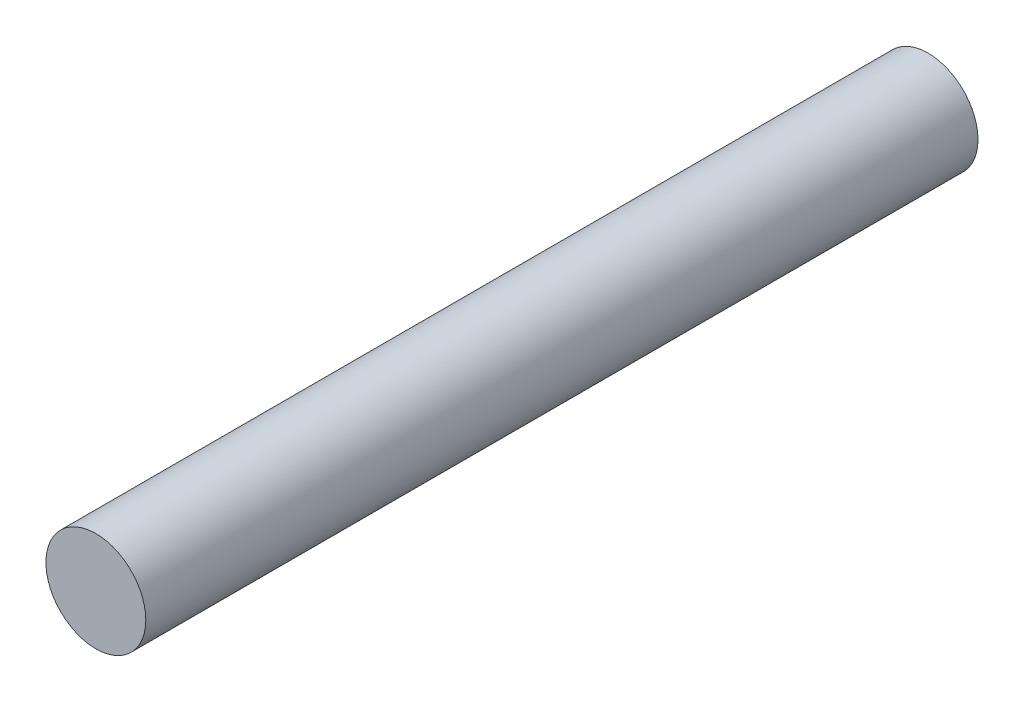
ISO-10303-21;
HEADER;
FILE_DESCRIPTION(('STEP AP214'),'2;1');
FILE_NAME('part.step','',(''),(''),'','','');
FILE_SCHEMA(('AUTOMOTIVE_DESIGN { 1 0 10303 214 1 1 1 1 }'));
ENDSEC;
DATA;
#1=APPLICATION_CONTEXT('core data for automotive mechanical design processes');
#2=APPLICATION_PROTOCOL_DEFINITION('international standard','automotive_design',2000,#1);
#3=PRODUCT_CONTEXT('',#1,'mechanical');
#4=PRODUCT('Part','Part','',(#3));
#5=PRODUCT_RELATED_PRODUCT_CATEGORY('part','',(#4));
#6=PRODUCT_DEFINITION_FORMATION('','',#4);
#7=PRODUCT_DEFINITION_CONTEXT('part definition',#1,'design');
#8=PRODUCT_DEFINITION('design','',#6,#7);
#9=PRODUCT_DEFINITION_SHAPE('','',#8);
#10=(LENGTH_UNIT() NAMED_UNIT(*) SI_UNIT(.MILLI.,.METRE.));
#11=(NAMED_UNIT(*) PLANE_ANGLE_UNIT() SI_UNIT($,.RADIAN.));
#12=(NAMED_UNIT(*) SI_UNIT($,.STERADIAN.) SOLID_ANGLE_UNIT());
#13=UNCERTAINTY_MEASURE_WITH_UNIT(LENGTH_MEASURE(1.E-05),#10,'distance_accuracy_value','');
#14=(GEOMETRIC_REPRESENTATION_CONTEXT(3) GLOBAL_UNCERTAINTY_ASSIGNED_CONTEXT((#13)) GLOBAL_UNIT_ASSIGNED_CONTEXT((#10,
#11,#12)) REPRESENTATION_CONTEXT('',''));
#15=CARTESIAN_POINT('',(0.,0.,0.));
#16=DIRECTION('',(0.,0.,1.));
#17=DIRECTION('',(1.,0.,0.));
#18=AXIS2_PLACEMENT_3D('',#15,#16,#17);
#19=CARTESIAN_POINT('',(0.,0.,25.));
#20=DIRECTION('',(0.,0.,-1.));
#21=DIRECTION('',(-1.,0.,0.));
#22=AXIS2_PLACEMENT_3D('',#19,#20,#21);
#23=CYLINDRICAL_SURFACE('',#22,1.5);
#24=CARTESIAN_POINT('',(0.,0.,25.));
#25=DIRECTION('',(0.,0.,1.));
#26=DIRECTION('',(1.,0.,0.));
#27=AXIS2_PLACEMENT_3D('',#24,#25,#26);
#28=CIRCLE('',#27,1.5);
#29=CARTESIAN_POINT('',(1.5,0.,25.));
#30=VERTEX_POINT('',#29);
#31=EDGE_CURVE('E10',#30,#30,#28,.T.);
#32=ORIENTED_EDGE('',*,*,#31,.F.);
#33=EDGE_LOOP('',(#32));
#34=FACE_BOUND('',#33,.T.);
#35=CARTESIAN_POINT('',(0.,0.,0.));
#36=DIRECTION('',(0.,0.,1.));
#37=DIRECTION('',(1.,0.,0.));
#38=AXIS2_PLACEMENT_3D('',#35,#36,#37);
#39=CIRCLE('',#38,1.5);
#40=CARTESIAN_POINT('',(1.5,0.,0.));
#41=VERTEX_POINT('',#40);
#42=EDGE_CURVE('E40',#41,#41,#39,.T.);
#43=ORIENTED_EDGE('',*,*,#42,.T.);
#44=EDGE_LOOP('',(#43));
#45=FACE_BOUND('',#44,.T.);
#46=ADVANCED_FACE('F37',(#34,#45),#23,.T.);
#47=CARTESIAN_POINT('',(0.,0.,25.));
#48=DIRECTION('',(0.,0.,1.));
#49=DIRECTION('',(1.,0.,0.));
#50=AXIS2_PLACEMENT_3D('',#47,#48,#49);
#51=PLANE('',#50);
#52=ORIENTED_EDGE('',*,*,#31,.T.);
#53=EDGE_LOOP('',(#52));
#54=FACE_BOUND('',#53,.T.);
#55=ADVANCED_FACE('F54',(#54),#51,.T.);
#56=CARTESIAN_POINT('',(0.,0.,0.));
#57=DIRECTION('',(0.,0.,1.));
#58=DIRECTION('',(1.,0.,0.));
#59=AXIS2_PLACEMENT_3D('',#56,#57,#58);
#60=PLANE('',#59);
#61=ORIENTED_EDGE('',*,*,#42,.F.);
#62=EDGE_LOOP('',(#61));
#63=FACE_BOUND('',#62,.T.);
#64=ADVANCED_FACE('F52',(#63),#60,.F.);
#65=CLOSED_SHELL('',(#46,#55,#64));
#66=MANIFOLD_SOLID_BREP('B2',#65);
#67=ADVANCED_BREP_SHAPE_REPRESENTATION('',(#18,#66),#14);
#68=SHAPE_DEFINITION_REPRESENTATION(#9,#67);
ENDSEC;
END-ISO-10303-21;
